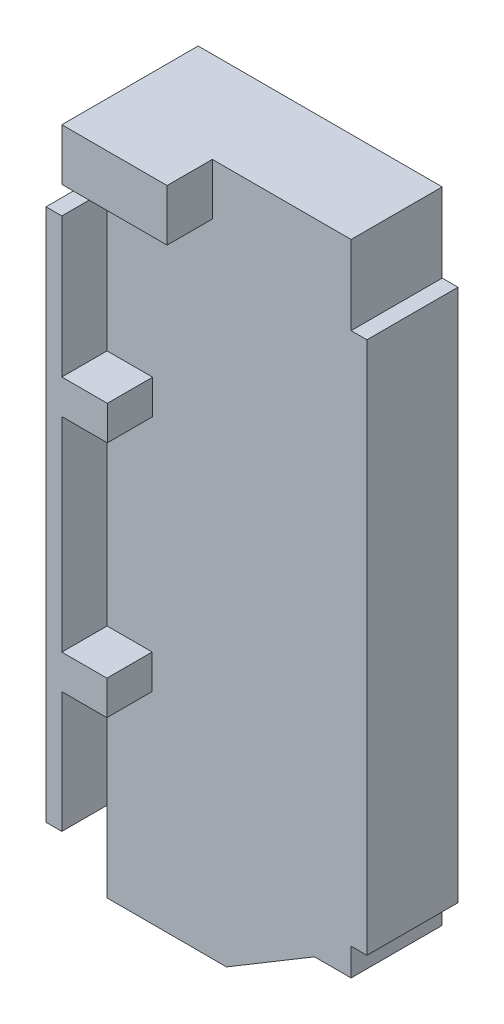
ISO-10303-21;
HEADER;
FILE_DESCRIPTION(('STEP AP214'),'2;1');
FILE_NAME('part.step','',(''),(''),'','','');
FILE_SCHEMA(('AUTOMOTIVE_DESIGN { 1 0 10303 214 1 1 1 1 }'));
ENDSEC;
DATA;
#1=APPLICATION_CONTEXT('core data for automotive mechanical design processes');
#2=APPLICATION_PROTOCOL_DEFINITION('international standard','automotive_design',2000,#1);
#3=PRODUCT_CONTEXT('',#1,'mechanical');
#4=PRODUCT('Part','Part','',(#3));
#5=PRODUCT_RELATED_PRODUCT_CATEGORY('part','',(#4));
#6=PRODUCT_DEFINITION_FORMATION('','',#4);
#7=PRODUCT_DEFINITION_CONTEXT('part definition',#1,'design');
#8=PRODUCT_DEFINITION('design','',#6,#7);
#9=PRODUCT_DEFINITION_SHAPE('','',#8);
#10=(LENGTH_UNIT() NAMED_UNIT(*) SI_UNIT(.MILLI.,.METRE.));
#11=(NAMED_UNIT(*) PLANE_ANGLE_UNIT() SI_UNIT($,.RADIAN.));
#12=(NAMED_UNIT(*) SI_UNIT($,.STERADIAN.) SOLID_ANGLE_UNIT());
#13=UNCERTAINTY_MEASURE_WITH_UNIT(LENGTH_MEASURE(1.E-05),#10,'distance_accuracy_value','');
#14=(GEOMETRIC_REPRESENTATION_CONTEXT(3) GLOBAL_UNCERTAINTY_ASSIGNED_CONTEXT((#13)) GLOBAL_UNIT_ASSIGNED_CONTEXT((#10,
#11,#12)) REPRESENTATION_CONTEXT('',''));
#15=CARTESIAN_POINT('',(0.,0.,0.));
#16=DIRECTION('',(0.,0.,1.));
#17=DIRECTION('',(1.,0.,0.));
#18=AXIS2_PLACEMENT_3D('',#15,#16,#17);
#19=CARTESIAN_POINT('',(0.,0.,0.));
#20=DIRECTION('',(0.,0.,1.));
#21=DIRECTION('',(1.,0.,0.));
#22=AXIS2_PLACEMENT_3D('',#19,#20,#21);
#23=PLANE('',#22);
#24=DIRECTION('',(0.,-1.,0.));
#25=VECTOR('',#24,1.);
#26=CARTESIAN_POINT('',(25.4000000000001,0.,0.));
#27=LINE('',#26,#25);
#28=CARTESIAN_POINT('',(25.4,422.275,0.));
#29=VERTEX_POINT('',#28);
#30=CARTESIAN_POINT('',(25.4,397.3703,0.));
#31=VERTEX_POINT('',#30);
#32=EDGE_CURVE('E53',#29,#31,#27,.T.);
#33=ORIENTED_EDGE('',*,*,#32,.T.);
#34=DIRECTION('',(1.,0.,0.));
#35=VECTOR('',#34,1.);
#36=CARTESIAN_POINT('',(0.,397.3703,0.));
#37=LINE('',#36,#35);
#38=CARTESIAN_POINT('',(-25.4,397.3703,0.));
#39=VERTEX_POINT('',#38);
#40=EDGE_CURVE('E618',#39,#31,#37,.T.);
#41=ORIENTED_EDGE('',*,*,#40,.F.);
#42=DIRECTION('',(0.,1.,0.));
#43=VECTOR('',#42,1.);
#44=CARTESIAN_POINT('',(-25.3999999999999,0.,0.));
#45=LINE('',#44,#43);
#46=CARTESIAN_POINT('',(-25.4,384.175,0.));
#47=VERTEX_POINT('',#46);
#48=EDGE_CURVE('E204',#47,#39,#45,.T.);
#49=ORIENTED_EDGE('',*,*,#48,.F.);
#50=DIRECTION('',(0.,-1.,0.));
#51=VECTOR('',#50,1.);
#52=CARTESIAN_POINT('',(-25.4,0.,0.));
#53=LINE('',#52,#51);
#54=CARTESIAN_POINT('',(-25.4,316.865,0.));
#55=VERTEX_POINT('',#54);
#56=EDGE_CURVE('E248',#47,#55,#53,.T.);
#57=ORIENTED_EDGE('',*,*,#56,.T.);
#58=DIRECTION('',(1.,0.,0.));
#59=VECTOR('',#58,1.);
#60=CARTESIAN_POINT('',(0.,316.865,0.));
#61=LINE('',#60,#59);
#62=CARTESIAN_POINT('',(-3.42900000000004,316.865,0.));
#63=VERTEX_POINT('',#62);
#64=EDGE_CURVE('E257',#55,#63,#61,.T.);
#65=ORIENTED_EDGE('',*,*,#64,.T.);
#66=DIRECTION('',(0.,-1.,0.));
#67=VECTOR('',#66,1.);
#68=CARTESIAN_POINT('',(-3.42899999999998,0.,0.));
#69=LINE('',#68,#67);
#70=CARTESIAN_POINT('',(-3.42900000000004,300.355,0.));
#71=VERTEX_POINT('',#70);
#72=EDGE_CURVE('E266',#63,#71,#69,.T.);
#73=ORIENTED_EDGE('',*,*,#72,.T.);
#74=DIRECTION('',(1.,0.,0.));
#75=VECTOR('',#74,1.);
#76=CARTESIAN_POINT('',(0.,300.355,0.));
#77=LINE('',#76,#75);
#78=CARTESIAN_POINT('',(-25.4,300.355,0.));
#79=VERTEX_POINT('',#78);
#80=EDGE_CURVE('E259',#79,#71,#77,.T.);
#81=ORIENTED_EDGE('',*,*,#80,.F.);
#82=CARTESIAN_POINT('',(-25.4,201.93,0.));
#83=VERTEX_POINT('',#82);
#84=EDGE_CURVE('E249',#79,#83,#53,.T.);
#85=ORIENTED_EDGE('',*,*,#84,.T.);
#86=DIRECTION('',(1.,0.,0.));
#87=VECTOR('',#86,1.);
#88=CARTESIAN_POINT('',(0.,201.93,0.));
#89=LINE('',#88,#87);
#90=CARTESIAN_POINT('',(-3.65760000000002,201.93,0.));
#91=VERTEX_POINT('',#90);
#92=EDGE_CURVE('E260',#83,#91,#89,.T.);
#93=ORIENTED_EDGE('',*,*,#92,.T.);
#94=DIRECTION('',(0.,-1.,0.));
#95=VECTOR('',#94,1.);
#96=CARTESIAN_POINT('',(-3.65760000000002,0.,0.));
#97=LINE('',#96,#95);
#98=CARTESIAN_POINT('',(-3.65760000000002,185.42,0.));
#99=VERTEX_POINT('',#98);
#100=EDGE_CURVE('E250',#91,#99,#97,.T.);
#101=ORIENTED_EDGE('',*,*,#100,.T.);
#102=DIRECTION('',(1.,0.,0.));
#103=VECTOR('',#102,1.);
#104=CARTESIAN_POINT('',(0.,185.42,0.));
#105=LINE('',#104,#103);
#106=CARTESIAN_POINT('',(-25.4,185.42,0.));
#107=VERTEX_POINT('',#106);
#108=EDGE_CURVE('E243',#107,#99,#105,.T.);
#109=ORIENTED_EDGE('',*,*,#108,.F.);
#110=CARTESIAN_POINT('',(-25.4,127.,0.));
#111=VERTEX_POINT('',#110);
#112=EDGE_CURVE('E239',#107,#111,#53,.T.);
#113=ORIENTED_EDGE('',*,*,#112,.T.);
#114=DIRECTION('',(0.,-1.,0.));
#115=VECTOR('',#114,1.);
#116=CARTESIAN_POINT('',(-25.4,0.,0.));
#117=LINE('',#116,#115);
#118=CARTESIAN_POINT('',(-25.4,88.2904,0.));
#119=VERTEX_POINT('',#118);
#120=EDGE_CURVE('E178',#111,#119,#117,.T.);
#121=ORIENTED_EDGE('',*,*,#120,.T.);
#122=DIRECTION('',(1.,0.,0.));
#123=VECTOR('',#122,1.);
#124=CARTESIAN_POINT('',(0.,88.2904,0.));
#125=LINE('',#124,#123);
#126=CARTESIAN_POINT('',(32.2122800000001,88.2904,0.));
#127=VERTEX_POINT('',#126);
#128=EDGE_CURVE('E181',#119,#127,#125,.T.);
#129=ORIENTED_EDGE('',*,*,#128,.T.);
#130=DIRECTION('',(-0.857827979027466,-0.513936920640708,0.));
#131=VECTOR('',#130,1.);
#132=CARTESIAN_POINT('',(-30.4162750213648,50.7687435621342,0.));
#133=LINE('',#132,#131);
#134=CARTESIAN_POINT('',(74.6506,113.7158,0.));
#135=VERTEX_POINT('',#134);
#136=EDGE_CURVE('E185',#135,#127,#133,.T.);
#137=ORIENTED_EDGE('',*,*,#136,.F.);
#138=DIRECTION('',(-1.,0.,0.));
#139=VECTOR('',#138,1.);
#140=CARTESIAN_POINT('',(0.,113.7158,0.));
#141=LINE('',#140,#139);
#142=CARTESIAN_POINT('',(92.329,113.7158,0.));
#143=VERTEX_POINT('',#142);
#144=EDGE_CURVE('E188',#143,#135,#141,.T.);
#145=ORIENTED_EDGE('',*,*,#144,.F.);
#146=DIRECTION('',(0.,-1.,0.));
#147=VECTOR('',#146,1.);
#148=CARTESIAN_POINT('',(92.329,0.,0.));
#149=LINE('',#148,#147);
#150=CARTESIAN_POINT('',(92.329,127.,0.));
#151=VERTEX_POINT('',#150);
#152=EDGE_CURVE('E190',#151,#143,#149,.T.);
#153=ORIENTED_EDGE('',*,*,#152,.F.);
#154=DIRECTION('',(1.,0.,0.));
#155=VECTOR('',#154,1.);
#156=CARTESIAN_POINT('',(0.,127.,0.));
#157=LINE('',#156,#155);
#158=CARTESIAN_POINT('',(99.949,127.,0.));
#159=VERTEX_POINT('',#158);
#160=EDGE_CURVE('E192',#151,#159,#157,.T.);
#161=ORIENTED_EDGE('',*,*,#160,.T.);
#162=DIRECTION('',(0.,-1.,0.));
#163=VECTOR('',#162,1.);
#164=CARTESIAN_POINT('',(99.949,0.,0.));
#165=LINE('',#164,#163);
#166=CARTESIAN_POINT('',(99.9489999999999,384.175,0.));
#167=VERTEX_POINT('',#166);
#168=EDGE_CURVE('E195',#167,#159,#165,.T.);
#169=ORIENTED_EDGE('',*,*,#168,.F.);
#170=DIRECTION('',(1.,0.,0.));
#171=VECTOR('',#170,1.);
#172=CARTESIAN_POINT('',(2.79868720790926E-12,384.175000000001,0.));
#173=LINE('',#172,#171);
#174=CARTESIAN_POINT('',(92.329,384.175,0.));
#175=VERTEX_POINT('',#174);
#176=EDGE_CURVE('E198',#175,#167,#173,.T.);
#177=ORIENTED_EDGE('',*,*,#176,.F.);
#178=DIRECTION('',(0.,1.,0.));
#179=VECTOR('',#178,1.);
#180=CARTESIAN_POINT('',(92.329,0.,0.));
#181=LINE('',#180,#179);
#182=CARTESIAN_POINT('',(92.329,422.275,0.));
#183=VERTEX_POINT('',#182);
#184=EDGE_CURVE('E200',#175,#183,#181,.T.);
#185=ORIENTED_EDGE('',*,*,#184,.T.);
#186=DIRECTION('',(1.,0.,0.));
#187=VECTOR('',#186,1.);
#188=CARTESIAN_POINT('',(0.,422.275,0.));
#189=LINE('',#188,#187);
#190=EDGE_CURVE('E102',#29,#183,#189,.T.);
#191=ORIENTED_EDGE('',*,*,#190,.F.);
#192=EDGE_LOOP('',(#33,#41,#49,#57,#65,#73,#81,#85,#93,#101,#109,#113,#121,#129,#137,#145,#153,
#161,#169,#177,#185,#191));
#193=FACE_BOUND('',#192,.T.);
#194=ADVANCED_FACE('F36',(#193),#23,.T.);
#195=CARTESIAN_POINT('',(0.,127.,-43.942));
#196=DIRECTION('',(0.,1.,0.));
#197=DIRECTION('',(0.,0.,1.));
#198=AXIS2_PLACEMENT_3D('',#195,#196,#197);
#199=PLANE('',#198);
#200=DIRECTION('',(0.,0.,1.));
#201=VECTOR('',#200,1.);
#202=CARTESIAN_POINT('',(-25.4,127.,-43.942));
#203=LINE('',#202,#201);
#204=CARTESIAN_POINT('',(-25.4,127.,-43.942));
#205=VERTEX_POINT('',#204);
#206=EDGE_CURVE('E40',#205,#111,#203,.T.);
#207=ORIENTED_EDGE('',*,*,#206,.T.);
#208=DIRECTION('',(0.,0.,-1.));
#209=VECTOR('',#208,1.);
#210=CARTESIAN_POINT('',(-25.4,127.,21.844));
#211=LINE('',#210,#209);
#212=CARTESIAN_POINT('',(-25.4,127.,21.844));
#213=VERTEX_POINT('',#212);
#214=EDGE_CURVE('E182',#213,#111,#211,.T.);
#215=ORIENTED_EDGE('',*,*,#214,.F.);
#216=DIRECTION('',(-1.,0.,0.));
#217=VECTOR('',#216,1.);
#218=CARTESIAN_POINT('',(0.,127.,21.844));
#219=LINE('',#218,#217);
#220=CARTESIAN_POINT('',(-33.02,127.,21.844));
#221=VERTEX_POINT('',#220);
#222=EDGE_CURVE('E637',#213,#221,#219,.T.);
#223=ORIENTED_EDGE('',*,*,#222,.T.);
#224=DIRECTION('',(0.,0.,1.));
#225=VECTOR('',#224,1.);
#226=CARTESIAN_POINT('',(-33.02,127.,-43.942));
#227=LINE('',#226,#225);
#228=CARTESIAN_POINT('',(-33.02,127.,-43.942));
#229=VERTEX_POINT('',#228);
#230=EDGE_CURVE('E11',#229,#221,#227,.T.);
#231=ORIENTED_EDGE('',*,*,#230,.F.);
#232=DIRECTION('',(-1.,0.,0.));
#233=VECTOR('',#232,1.);
#234=CARTESIAN_POINT('',(0.,127.,-43.942));
#235=LINE('',#234,#233);
#236=EDGE_CURVE('E62',#205,#229,#235,.T.);
#237=ORIENTED_EDGE('',*,*,#236,.F.);
#238=EDGE_LOOP('',(#207,#215,#223,#231,#237));
#239=FACE_BOUND('',#238,.T.);
#240=ADVANCED_FACE('F38',(#239),#199,.F.);
#241=CARTESIAN_POINT('',(-33.02,0.,-43.942));
#242=DIRECTION('',(-1.,0.,0.));
#243=DIRECTION('',(0.,-1.,0.));
#244=AXIS2_PLACEMENT_3D('',#241,#242,#243);
#245=PLANE('',#244);
#246=ORIENTED_EDGE('',*,*,#230,.T.);
#247=DIRECTION('',(0.,-1.,0.));
#248=VECTOR('',#247,1.);
#249=CARTESIAN_POINT('',(-33.02,0.,21.844));
#250=LINE('',#249,#248);
#251=CARTESIAN_POINT('',(-33.02,384.175,21.844));
#252=VERTEX_POINT('',#251);
#253=EDGE_CURVE('E634',#252,#221,#250,.T.);
#254=ORIENTED_EDGE('',*,*,#253,.F.);
#255=DIRECTION('',(0.,0.,1.));
#256=VECTOR('',#255,1.);
#257=CARTESIAN_POINT('',(-33.02,384.175,-43.942));
#258=LINE('',#257,#256);
#259=CARTESIAN_POINT('',(-33.02,384.175,-43.942));
#260=VERTEX_POINT('',#259);
#261=EDGE_CURVE('E45',#260,#252,#258,.T.);
#262=ORIENTED_EDGE('',*,*,#261,.F.);
#263=DIRECTION('',(0.,-1.,0.));
#264=VECTOR('',#263,1.);
#265=CARTESIAN_POINT('',(-33.02,0.,-43.942));
#266=LINE('',#265,#264);
#267=EDGE_CURVE('E173',#260,#229,#266,.T.);
#268=ORIENTED_EDGE('',*,*,#267,.T.);
#269=EDGE_LOOP('',(#246,#254,#262,#268));
#270=FACE_BOUND('',#269,.T.);
#271=ADVANCED_FACE('F373',(#270),#245,.T.);
#272=CARTESIAN_POINT('',(-2.79868720790925E-12,384.175,-43.942));
#273=DIRECTION('',(0.,1.,0.));
#274=DIRECTION('',(-1.,0.,0.));
#275=AXIS2_PLACEMENT_3D('',#272,#273,#274);
#276=PLANE('',#275);
#277=ORIENTED_EDGE('',*,*,#261,.T.);
#278=DIRECTION('',(-1.,0.,0.));
#279=VECTOR('',#278,1.);
#280=CARTESIAN_POINT('',(-2.79868720790925E-12,384.175,21.844));
#281=LINE('',#280,#279);
#282=CARTESIAN_POINT('',(-25.4,384.175,21.844));
#283=VERTEX_POINT('',#282);
#284=EDGE_CURVE('E256',#283,#252,#281,.T.);
#285=ORIENTED_EDGE('',*,*,#284,.F.);
#286=DIRECTION('',(0.,0.,-1.));
#287=VECTOR('',#286,1.);
#288=CARTESIAN_POINT('',(-25.4,384.175,21.844));
#289=LINE('',#288,#287);
#290=EDGE_CURVE('E156',#283,#47,#289,.T.);
#291=ORIENTED_EDGE('',*,*,#290,.T.);
#292=DIRECTION('',(0.,0.,1.));
#293=VECTOR('',#292,1.);
#294=CARTESIAN_POINT('',(-25.4,384.175,-43.942));
#295=LINE('',#294,#293);
#296=CARTESIAN_POINT('',(-25.4,384.175,-43.942));
#297=VERTEX_POINT('',#296);
#298=EDGE_CURVE('E148',#297,#47,#295,.T.);
#299=ORIENTED_EDGE('',*,*,#298,.F.);
#300=DIRECTION('',(-1.,0.,0.));
#301=VECTOR('',#300,1.);
#302=CARTESIAN_POINT('',(-2.79868720790925E-12,384.175,-43.942));
#303=LINE('',#302,#301);
#304=EDGE_CURVE('E153',#297,#260,#303,.T.);
#305=ORIENTED_EDGE('',*,*,#304,.T.);
#306=EDGE_LOOP('',(#277,#285,#291,#299,#305));
#307=FACE_BOUND('',#306,.T.);
#308=ADVANCED_FACE('F151',(#307),#276,.T.);
#309=CARTESIAN_POINT('',(-25.3999999999999,0.,-43.942));
#310=DIRECTION('',(1.,0.,0.));
#311=DIRECTION('',(0.,1.,0.));
#312=AXIS2_PLACEMENT_3D('',#309,#310,#311);
#313=PLANE('',#312);
#314=ORIENTED_EDGE('',*,*,#48,.T.);
#315=DIRECTION('',(0.,0.,-1.));
#316=VECTOR('',#315,1.);
#317=CARTESIAN_POINT('',(-25.4,397.3703,21.844));
#318=LINE('',#317,#316);
#319=CARTESIAN_POINT('',(-25.4,397.3703,21.844));
#320=VERTEX_POINT('',#319);
#321=EDGE_CURVE('E252',#320,#39,#318,.T.);
#322=ORIENTED_EDGE('',*,*,#321,.F.);
#323=DIRECTION('',(0.,1.,0.));
#324=VECTOR('',#323,1.);
#325=CARTESIAN_POINT('',(-25.3999999999999,0.,21.844));
#326=LINE('',#325,#324);
#327=CARTESIAN_POINT('',(-25.4,422.275,21.844));
#328=VERTEX_POINT('',#327);
#329=EDGE_CURVE('E620',#320,#328,#326,.T.);
#330=ORIENTED_EDGE('',*,*,#329,.T.);
#331=DIRECTION('',(0.,0.,1.));
#332=VECTOR('',#331,1.);
#333=CARTESIAN_POINT('',(-25.4,422.275,-43.942));
#334=LINE('',#333,#332);
#335=CARTESIAN_POINT('',(-25.4,422.275,-43.942));
#336=VERTEX_POINT('',#335);
#337=EDGE_CURVE('E161',#336,#328,#334,.T.);
#338=ORIENTED_EDGE('',*,*,#337,.F.);
#339=DIRECTION('',(0.,1.,0.));
#340=VECTOR('',#339,1.);
#341=CARTESIAN_POINT('',(-25.3999999999999,0.,-43.942));
#342=LINE('',#341,#340);
#343=EDGE_CURVE('E164',#297,#336,#342,.T.);
#344=ORIENTED_EDGE('',*,*,#343,.F.);
#345=ORIENTED_EDGE('',*,*,#298,.T.);
#346=EDGE_LOOP('',(#314,#322,#330,#338,#344,#345));
#347=FACE_BOUND('',#346,.T.);
#348=ADVANCED_FACE('F165',(#347),#313,.F.);
#349=CARTESIAN_POINT('',(0.,422.275,-43.942));
#350=DIRECTION('',(0.,-1.,0.));
#351=DIRECTION('',(0.,0.,-1.));
#352=AXIS2_PLACEMENT_3D('',#349,#350,#351);
#353=PLANE('',#352);
#354=ORIENTED_EDGE('',*,*,#337,.T.);
#355=DIRECTION('',(1.,0.,0.));
#356=VECTOR('',#355,1.);
#357=CARTESIAN_POINT('',(0.,422.275,21.844));
#358=LINE('',#357,#356);
#359=CARTESIAN_POINT('',(25.3999999999999,422.275,21.844));
#360=VERTEX_POINT('',#359);
#361=EDGE_CURVE('E611',#328,#360,#358,.T.);
#362=ORIENTED_EDGE('',*,*,#361,.T.);
#363=DIRECTION('',(0.,0.,-1.));
#364=VECTOR('',#363,1.);
#365=CARTESIAN_POINT('',(25.3999999999999,422.275,21.844));
#366=LINE('',#365,#364);
#367=EDGE_CURVE('E246',#360,#29,#366,.T.);
#368=ORIENTED_EDGE('',*,*,#367,.T.);
#369=ORIENTED_EDGE('',*,*,#190,.T.);
#370=DIRECTION('',(0.,0.,1.));
#371=VECTOR('',#370,1.);
#372=CARTESIAN_POINT('',(92.329,422.275,-43.942));
#373=LINE('',#372,#371);
#374=CARTESIAN_POINT('',(92.329,422.275,-43.942));
#375=VERTEX_POINT('',#374);
#376=EDGE_CURVE('E208',#375,#183,#373,.T.);
#377=ORIENTED_EDGE('',*,*,#376,.F.);
#378=DIRECTION('',(1.,0.,0.));
#379=VECTOR('',#378,1.);
#380=CARTESIAN_POINT('',(0.,422.275,-43.942));
#381=LINE('',#380,#379);
#382=EDGE_CURVE('E169',#336,#375,#381,.T.);
#383=ORIENTED_EDGE('',*,*,#382,.F.);
#384=EDGE_LOOP('',(#354,#362,#368,#369,#377,#383));
#385=FACE_BOUND('',#384,.T.);
#386=ADVANCED_FACE('F326',(#385),#353,.F.);
#387=CARTESIAN_POINT('',(92.329,0.,-43.942));
#388=DIRECTION('',(1.,0.,0.));
#389=DIRECTION('',(0.,0.,-1.));
#390=AXIS2_PLACEMENT_3D('',#387,#388,#389);
#391=PLANE('',#390);
#392=ORIENTED_EDGE('',*,*,#184,.F.);
#393=DIRECTION('',(0.,0.,1.));
#394=VECTOR('',#393,1.);
#395=CARTESIAN_POINT('',(92.329,384.175,-43.942));
#396=LINE('',#395,#394);
#397=CARTESIAN_POINT('',(92.329,384.175,-43.942));
#398=VERTEX_POINT('',#397);
#399=EDGE_CURVE('E210',#398,#175,#396,.T.);
#400=ORIENTED_EDGE('',*,*,#399,.F.);
#401=DIRECTION('',(0.,1.,0.));
#402=VECTOR('',#401,1.);
#403=CARTESIAN_POINT('',(92.329,0.,-43.942));
#404=LINE('',#403,#402);
#405=EDGE_CURVE('E323',#398,#375,#404,.T.);
#406=ORIENTED_EDGE('',*,*,#405,.T.);
#407=ORIENTED_EDGE('',*,*,#376,.T.);
#408=EDGE_LOOP('',(#392,#400,#406,#407));
#409=FACE_BOUND('',#408,.T.);
#410=ADVANCED_FACE('F329',(#409),#391,.T.);
#411=CARTESIAN_POINT('',(2.79868720790926E-12,384.175000000001,-43.942));
#412=DIRECTION('',(0.,-1.,0.));
#413=DIRECTION('',(1.,0.,0.));
#414=AXIS2_PLACEMENT_3D('',#411,#412,#413);
#415=PLANE('',#414);
#416=ORIENTED_EDGE('',*,*,#176,.T.);
#417=DIRECTION('',(0.,0.,1.));
#418=VECTOR('',#417,1.);
#419=CARTESIAN_POINT('',(99.9489999999999,384.175,-43.942));
#420=LINE('',#419,#418);
#421=CARTESIAN_POINT('',(99.9489999999999,384.175,-43.942));
#422=VERTEX_POINT('',#421);
#423=EDGE_CURVE('E212',#422,#167,#420,.T.);
#424=ORIENTED_EDGE('',*,*,#423,.F.);
#425=DIRECTION('',(1.,0.,0.));
#426=VECTOR('',#425,1.);
#427=CARTESIAN_POINT('',(2.79868720790926E-12,384.175000000001,-43.942));
#428=LINE('',#427,#426);
#429=EDGE_CURVE('E321',#398,#422,#428,.T.);
#430=ORIENTED_EDGE('',*,*,#429,.F.);
#431=ORIENTED_EDGE('',*,*,#399,.T.);
#432=EDGE_LOOP('',(#416,#424,#430,#431));
#433=FACE_BOUND('',#432,.T.);
#434=ADVANCED_FACE('F334',(#433),#415,.F.);
#435=CARTESIAN_POINT('',(99.949,0.,-43.942));
#436=DIRECTION('',(-1.,0.,0.));
#437=DIRECTION('',(0.,-1.,0.));
#438=AXIS2_PLACEMENT_3D('',#435,#436,#437);
#439=PLANE('',#438);
#440=ORIENTED_EDGE('',*,*,#168,.T.);
#441=DIRECTION('',(0.,0.,1.));
#442=VECTOR('',#441,1.);
#443=CARTESIAN_POINT('',(99.949,127.,-43.942));
#444=LINE('',#443,#442);
#445=CARTESIAN_POINT('',(99.949,127.,-43.942));
#446=VERTEX_POINT('',#445);
#447=EDGE_CURVE('E215',#446,#159,#444,.T.);
#448=ORIENTED_EDGE('',*,*,#447,.F.);
#449=DIRECTION('',(0.,-1.,0.));
#450=VECTOR('',#449,1.);
#451=CARTESIAN_POINT('',(99.949,0.,-43.942));
#452=LINE('',#451,#450);
#453=EDGE_CURVE('E319',#422,#446,#452,.T.);
#454=ORIENTED_EDGE('',*,*,#453,.F.);
#455=ORIENTED_EDGE('',*,*,#423,.T.);
#456=EDGE_LOOP('',(#440,#448,#454,#455));
#457=FACE_BOUND('',#456,.T.);
#458=ADVANCED_FACE('F339',(#457),#439,.F.);
#459=CARTESIAN_POINT('',(0.,127.,-43.942));
#460=DIRECTION('',(0.,-1.,0.));
#461=DIRECTION('',(0.,0.,-1.));
#462=AXIS2_PLACEMENT_3D('',#459,#460,#461);
#463=PLANE('',#462);
#464=ORIENTED_EDGE('',*,*,#160,.F.);
#465=DIRECTION('',(0.,0.,1.));
#466=VECTOR('',#465,1.);
#467=CARTESIAN_POINT('',(92.329,127.,-43.942));
#468=LINE('',#467,#466);
#469=CARTESIAN_POINT('',(92.329,127.,-43.942));
#470=VERTEX_POINT('',#469);
#471=EDGE_CURVE('E217',#470,#151,#468,.T.);
#472=ORIENTED_EDGE('',*,*,#471,.F.);
#473=DIRECTION('',(1.,0.,0.));
#474=VECTOR('',#473,1.);
#475=CARTESIAN_POINT('',(0.,127.,-43.942));
#476=LINE('',#475,#474);
#477=EDGE_CURVE('E316',#470,#446,#476,.T.);
#478=ORIENTED_EDGE('',*,*,#477,.T.);
#479=ORIENTED_EDGE('',*,*,#447,.T.);
#480=EDGE_LOOP('',(#464,#472,#478,#479));
#481=FACE_BOUND('',#480,.T.);
#482=ADVANCED_FACE('F343',(#481),#463,.T.);
#483=CARTESIAN_POINT('',(92.329,0.,-43.942));
#484=DIRECTION('',(-1.,0.,0.));
#485=DIRECTION('',(0.,0.,1.));
#486=AXIS2_PLACEMENT_3D('',#483,#484,#485);
#487=PLANE('',#486);
#488=ORIENTED_EDGE('',*,*,#152,.T.);
#489=DIRECTION('',(0.,0.,1.));
#490=VECTOR('',#489,1.);
#491=CARTESIAN_POINT('',(92.329,113.7158,-43.942));
#492=LINE('',#491,#490);
#493=CARTESIAN_POINT('',(92.329,113.7158,-43.942));
#494=VERTEX_POINT('',#493);
#495=EDGE_CURVE('E219',#494,#143,#492,.T.);
#496=ORIENTED_EDGE('',*,*,#495,.F.);
#497=DIRECTION('',(0.,-1.,0.));
#498=VECTOR('',#497,1.);
#499=CARTESIAN_POINT('',(92.329,0.,-43.942));
#500=LINE('',#499,#498);
#501=EDGE_CURVE('E314',#470,#494,#500,.T.);
#502=ORIENTED_EDGE('',*,*,#501,.F.);
#503=ORIENTED_EDGE('',*,*,#471,.T.);
#504=EDGE_LOOP('',(#488,#496,#502,#503));
#505=FACE_BOUND('',#504,.T.);
#506=ADVANCED_FACE('F348',(#505),#487,.F.);
#507=CARTESIAN_POINT('',(0.,113.7158,-43.942));
#508=DIRECTION('',(0.,1.,0.));
#509=DIRECTION('',(0.,0.,1.));
#510=AXIS2_PLACEMENT_3D('',#507,#508,#509);
#511=PLANE('',#510);
#512=ORIENTED_EDGE('',*,*,#144,.T.);
#513=DIRECTION('',(0.,0.,1.));
#514=VECTOR('',#513,1.);
#515=CARTESIAN_POINT('',(74.6506,113.7158,-43.942));
#516=LINE('',#515,#514);
#517=CARTESIAN_POINT('',(74.6506,113.7158,-43.942));
#518=VERTEX_POINT('',#517);
#519=EDGE_CURVE('E222',#518,#135,#516,.T.);
#520=ORIENTED_EDGE('',*,*,#519,.F.);
#521=DIRECTION('',(-1.,0.,0.));
#522=VECTOR('',#521,1.);
#523=CARTESIAN_POINT('',(0.,113.7158,-43.942));
#524=LINE('',#523,#522);
#525=EDGE_CURVE('E312',#494,#518,#524,.T.);
#526=ORIENTED_EDGE('',*,*,#525,.F.);
#527=ORIENTED_EDGE('',*,*,#495,.T.);
#528=EDGE_LOOP('',(#512,#520,#526,#527));
#529=FACE_BOUND('',#528,.T.);
#530=ADVANCED_FACE('F355',(#529),#511,.F.);
#531=CARTESIAN_POINT('',(-30.4162750213648,50.7687435621342,-43.942));
#532=DIRECTION('',(-0.513936920640708,0.857827979027466,0.));
#533=DIRECTION('',(-0.857827979027466,-0.513936920640708,0.));
#534=AXIS2_PLACEMENT_3D('',#531,#532,#533);
#535=PLANE('',#534);
#536=ORIENTED_EDGE('',*,*,#136,.T.);
#537=DIRECTION('',(0.,0.,1.));
#538=VECTOR('',#537,1.);
#539=CARTESIAN_POINT('',(32.2122800000001,88.2904,-43.942));
#540=LINE('',#539,#538);
#541=CARTESIAN_POINT('',(32.2122800000001,88.2904,-43.942));
#542=VERTEX_POINT('',#541);
#543=EDGE_CURVE('E225',#542,#127,#540,.T.);
#544=ORIENTED_EDGE('',*,*,#543,.F.);
#545=DIRECTION('',(-0.857827979027466,-0.513936920640708,0.));
#546=VECTOR('',#545,1.);
#547=CARTESIAN_POINT('',(-30.4162750213648,50.7687435621342,-43.942));
#548=LINE('',#547,#546);
#549=EDGE_CURVE('E310',#518,#542,#548,.T.);
#550=ORIENTED_EDGE('',*,*,#549,.F.);
#551=ORIENTED_EDGE('',*,*,#519,.T.);
#552=EDGE_LOOP('',(#536,#544,#550,#551));
#553=FACE_BOUND('',#552,.T.);
#554=ADVANCED_FACE('F358',(#553),#535,.F.);
#555=CARTESIAN_POINT('',(0.,88.2904,-43.942));
#556=DIRECTION('',(0.,-1.,0.));
#557=DIRECTION('',(0.,0.,-1.));
#558=AXIS2_PLACEMENT_3D('',#555,#556,#557);
#559=PLANE('',#558);
#560=ORIENTED_EDGE('',*,*,#128,.F.);
#561=DIRECTION('',(0.,0.,1.));
#562=VECTOR('',#561,1.);
#563=CARTESIAN_POINT('',(-25.4,88.2904,-43.942));
#564=LINE('',#563,#562);
#565=CARTESIAN_POINT('',(-25.4,88.2904,-43.942));
#566=VERTEX_POINT('',#565);
#567=EDGE_CURVE('E226',#566,#119,#564,.T.);
#568=ORIENTED_EDGE('',*,*,#567,.F.);
#569=DIRECTION('',(1.,0.,0.));
#570=VECTOR('',#569,1.);
#571=CARTESIAN_POINT('',(0.,88.2904,-43.942));
#572=LINE('',#571,#570);
#573=EDGE_CURVE('E307',#566,#542,#572,.T.);
#574=ORIENTED_EDGE('',*,*,#573,.T.);
#575=ORIENTED_EDGE('',*,*,#543,.T.);
#576=EDGE_LOOP('',(#560,#568,#574,#575));
#577=FACE_BOUND('',#576,.T.);
#578=ADVANCED_FACE('F360',(#577),#559,.T.);
#579=CARTESIAN_POINT('',(-25.4,0.,-43.942));
#580=DIRECTION('',(-1.,0.,0.));
#581=DIRECTION('',(0.,-1.,0.));
#582=AXIS2_PLACEMENT_3D('',#579,#580,#581);
#583=PLANE('',#582);
#584=ORIENTED_EDGE('',*,*,#120,.F.);
#585=ORIENTED_EDGE('',*,*,#206,.F.);
#586=DIRECTION('',(0.,-1.,0.));
#587=VECTOR('',#586,1.);
#588=CARTESIAN_POINT('',(-25.4,0.,-43.942));
#589=LINE('',#588,#587);
#590=EDGE_CURVE('E305',#205,#566,#589,.T.);
#591=ORIENTED_EDGE('',*,*,#590,.T.);
#592=ORIENTED_EDGE('',*,*,#567,.T.);
#593=EDGE_LOOP('',(#584,#585,#591,#592));
#594=FACE_BOUND('',#593,.T.);
#595=ADVANCED_FACE('F233',(#594),#583,.T.);
#596=CARTESIAN_POINT('',(0.,0.,-43.942));
#597=DIRECTION('',(0.,0.,1.));
#598=DIRECTION('',(1.,0.,0.));
#599=AXIS2_PLACEMENT_3D('',#596,#597,#598);
#600=PLANE('',#599);
#601=ORIENTED_EDGE('',*,*,#236,.T.);
#602=ORIENTED_EDGE('',*,*,#267,.F.);
#603=ORIENTED_EDGE('',*,*,#304,.F.);
#604=ORIENTED_EDGE('',*,*,#343,.T.);
#605=ORIENTED_EDGE('',*,*,#382,.T.);
#606=ORIENTED_EDGE('',*,*,#405,.F.);
#607=ORIENTED_EDGE('',*,*,#429,.T.);
#608=ORIENTED_EDGE('',*,*,#453,.T.);
#609=ORIENTED_EDGE('',*,*,#477,.F.);
#610=ORIENTED_EDGE('',*,*,#501,.T.);
#611=ORIENTED_EDGE('',*,*,#525,.T.);
#612=ORIENTED_EDGE('',*,*,#549,.T.);
#613=ORIENTED_EDGE('',*,*,#573,.F.);
#614=ORIENTED_EDGE('',*,*,#590,.F.);
#615=EDGE_LOOP('',(#601,#602,#603,#604,#605,#606,#607,#608,#609,#610,#611,#612,#613,#614));
#616=FACE_BOUND('',#615,.T.);
#617=ADVANCED_FACE('F171',(#616),#600,.F.);
#618=CARTESIAN_POINT('',(-25.4,0.,21.844));
#619=DIRECTION('',(1.,0.,0.));
#620=DIRECTION('',(0.,1.,0.));
#621=AXIS2_PLACEMENT_3D('',#618,#619,#620);
#622=PLANE('',#621);
#623=ORIENTED_EDGE('',*,*,#112,.F.);
#624=DIRECTION('',(0.,0.,-1.));
#625=VECTOR('',#624,1.);
#626=CARTESIAN_POINT('',(-25.4,185.42,21.844));
#627=LINE('',#626,#625);
#628=CARTESIAN_POINT('',(-25.4,185.42,21.844));
#629=VERTEX_POINT('',#628);
#630=EDGE_CURVE('E300',#629,#107,#627,.T.);
#631=ORIENTED_EDGE('',*,*,#630,.F.);
#632=DIRECTION('',(0.,-1.,0.));
#633=VECTOR('',#632,1.);
#634=CARTESIAN_POINT('',(-25.4,0.,21.844));
#635=LINE('',#634,#633);
#636=EDGE_CURVE('E639',#629,#213,#635,.T.);
#637=ORIENTED_EDGE('',*,*,#636,.T.);
#638=ORIENTED_EDGE('',*,*,#214,.T.);
#639=EDGE_LOOP('',(#623,#631,#637,#638));
#640=FACE_BOUND('',#639,.T.);
#641=ADVANCED_FACE('F418',(#640),#622,.T.);
#642=CARTESIAN_POINT('',(0.,185.42,21.844));
#643=DIRECTION('',(0.,1.,0.));
#644=DIRECTION('',(0.,0.,1.));
#645=AXIS2_PLACEMENT_3D('',#642,#643,#644);
#646=PLANE('',#645);
#647=ORIENTED_EDGE('',*,*,#108,.T.);
#648=DIRECTION('',(0.,0.,-1.));
#649=VECTOR('',#648,1.);
#650=CARTESIAN_POINT('',(-3.65760000000002,185.42,21.844));
#651=LINE('',#650,#649);
#652=CARTESIAN_POINT('',(-3.65760000000002,185.42,21.844));
#653=VERTEX_POINT('',#652);
#654=EDGE_CURVE('E297',#653,#99,#651,.T.);
#655=ORIENTED_EDGE('',*,*,#654,.F.);
#656=DIRECTION('',(1.,0.,0.));
#657=VECTOR('',#656,1.);
#658=CARTESIAN_POINT('',(0.,185.42,21.844));
#659=LINE('',#658,#657);
#660=EDGE_CURVE('E642',#629,#653,#659,.T.);
#661=ORIENTED_EDGE('',*,*,#660,.F.);
#662=ORIENTED_EDGE('',*,*,#630,.T.);
#663=EDGE_LOOP('',(#647,#655,#661,#662));
#664=FACE_BOUND('',#663,.T.);
#665=ADVANCED_FACE('F476',(#664),#646,.F.);
#666=CARTESIAN_POINT('',(-3.65760000000002,0.,21.844));
#667=DIRECTION('',(1.,0.,0.));
#668=DIRECTION('',(0.,1.,0.));
#669=AXIS2_PLACEMENT_3D('',#666,#667,#668);
#670=PLANE('',#669);
#671=ORIENTED_EDGE('',*,*,#100,.F.);
#672=DIRECTION('',(0.,0.,-1.));
#673=VECTOR('',#672,1.);
#674=CARTESIAN_POINT('',(-3.65760000000002,201.93,21.844));
#675=LINE('',#674,#673);
#676=CARTESIAN_POINT('',(-3.65760000000002,201.93,21.844));
#677=VERTEX_POINT('',#676);
#678=EDGE_CURVE('E294',#677,#91,#675,.T.);
#679=ORIENTED_EDGE('',*,*,#678,.F.);
#680=DIRECTION('',(0.,-1.,0.));
#681=VECTOR('',#680,1.);
#682=CARTESIAN_POINT('',(-3.65760000000002,0.,21.844));
#683=LINE('',#682,#681);
#684=EDGE_CURVE('E646',#677,#653,#683,.T.);
#685=ORIENTED_EDGE('',*,*,#684,.T.);
#686=ORIENTED_EDGE('',*,*,#654,.T.);
#687=EDGE_LOOP('',(#671,#679,#685,#686));
#688=FACE_BOUND('',#687,.T.);
#689=ADVANCED_FACE('F488',(#688),#670,.T.);
#690=CARTESIAN_POINT('',(0.,201.93,21.844));
#691=DIRECTION('',(0.,1.,0.));
#692=DIRECTION('',(0.,0.,1.));
#693=AXIS2_PLACEMENT_3D('',#690,#691,#692);
#694=PLANE('',#693);
#695=ORIENTED_EDGE('',*,*,#92,.F.);
#696=DIRECTION('',(0.,0.,-1.));
#697=VECTOR('',#696,1.);
#698=CARTESIAN_POINT('',(-25.4,201.93,21.844));
#699=LINE('',#698,#697);
#700=CARTESIAN_POINT('',(-25.4,201.93,21.844));
#701=VERTEX_POINT('',#700);
#702=EDGE_CURVE('E291',#701,#83,#699,.T.);
#703=ORIENTED_EDGE('',*,*,#702,.F.);
#704=DIRECTION('',(1.,0.,0.));
#705=VECTOR('',#704,1.);
#706=CARTESIAN_POINT('',(0.,201.93,21.844));
#707=LINE('',#706,#705);
#708=EDGE_CURVE('E649',#701,#677,#707,.T.);
#709=ORIENTED_EDGE('',*,*,#708,.T.);
#710=ORIENTED_EDGE('',*,*,#678,.T.);
#711=EDGE_LOOP('',(#695,#703,#709,#710));
#712=FACE_BOUND('',#711,.T.);
#713=ADVANCED_FACE('F497',(#712),#694,.T.);
#714=ORIENTED_EDGE('',*,*,#84,.F.);
#715=DIRECTION('',(0.,0.,-1.));
#716=VECTOR('',#715,1.);
#717=CARTESIAN_POINT('',(-25.4,300.355,21.844));
#718=LINE('',#717,#716);
#719=CARTESIAN_POINT('',(-25.4,300.355,21.844));
#720=VERTEX_POINT('',#719);
#721=EDGE_CURVE('E288',#720,#79,#718,.T.);
#722=ORIENTED_EDGE('',*,*,#721,.F.);
#723=EDGE_CURVE('E643',#720,#701,#635,.T.);
#724=ORIENTED_EDGE('',*,*,#723,.T.);
#725=ORIENTED_EDGE('',*,*,#702,.T.);
#726=EDGE_LOOP('',(#714,#722,#724,#725));
#727=FACE_BOUND('',#726,.T.);
#728=ADVANCED_FACE('F478',(#727),#622,.T.);
#729=CARTESIAN_POINT('',(0.,300.355,21.844));
#730=DIRECTION('',(0.,1.,0.));
#731=DIRECTION('',(0.,0.,1.));
#732=AXIS2_PLACEMENT_3D('',#729,#730,#731);
#733=PLANE('',#732);
#734=ORIENTED_EDGE('',*,*,#80,.T.);
#735=DIRECTION('',(0.,0.,-1.));
#736=VECTOR('',#735,1.);
#737=CARTESIAN_POINT('',(-3.42900000000004,300.355,21.844));
#738=LINE('',#737,#736);
#739=CARTESIAN_POINT('',(-3.42900000000004,300.355,21.844));
#740=VERTEX_POINT('',#739);
#741=EDGE_CURVE('E285',#740,#71,#738,.T.);
#742=ORIENTED_EDGE('',*,*,#741,.F.);
#743=DIRECTION('',(1.,0.,0.));
#744=VECTOR('',#743,1.);
#745=CARTESIAN_POINT('',(0.,300.355,21.844));
#746=LINE('',#745,#744);
#747=EDGE_CURVE('E652',#720,#740,#746,.T.);
#748=ORIENTED_EDGE('',*,*,#747,.F.);
#749=ORIENTED_EDGE('',*,*,#721,.T.);
#750=EDGE_LOOP('',(#734,#742,#748,#749));
#751=FACE_BOUND('',#750,.T.);
#752=ADVANCED_FACE('F517',(#751),#733,.F.);
#753=CARTESIAN_POINT('',(-3.42899999999998,0.,21.844));
#754=DIRECTION('',(1.,0.,0.));
#755=DIRECTION('',(0.,1.,0.));
#756=AXIS2_PLACEMENT_3D('',#753,#754,#755);
#757=PLANE('',#756);
#758=ORIENTED_EDGE('',*,*,#72,.F.);
#759=DIRECTION('',(0.,0.,-1.));
#760=VECTOR('',#759,1.);
#761=CARTESIAN_POINT('',(-3.42900000000004,316.865,21.844));
#762=LINE('',#761,#760);
#763=CARTESIAN_POINT('',(-3.42900000000004,316.865,21.844));
#764=VERTEX_POINT('',#763);
#765=EDGE_CURVE('E282',#764,#63,#762,.T.);
#766=ORIENTED_EDGE('',*,*,#765,.F.);
#767=DIRECTION('',(0.,-1.,0.));
#768=VECTOR('',#767,1.);
#769=CARTESIAN_POINT('',(-3.42899999999998,0.,21.844));
#770=LINE('',#769,#768);
#771=EDGE_CURVE('E655',#764,#740,#770,.T.);
#772=ORIENTED_EDGE('',*,*,#771,.T.);
#773=ORIENTED_EDGE('',*,*,#741,.T.);
#774=EDGE_LOOP('',(#758,#766,#772,#773));
#775=FACE_BOUND('',#774,.T.);
#776=ADVANCED_FACE('F527',(#775),#757,.T.);
#777=CARTESIAN_POINT('',(0.,316.865,21.844));
#778=DIRECTION('',(0.,1.,0.));
#779=DIRECTION('',(0.,0.,1.));
#780=AXIS2_PLACEMENT_3D('',#777,#778,#779);
#781=PLANE('',#780);
#782=ORIENTED_EDGE('',*,*,#64,.F.);
#783=DIRECTION('',(0.,0.,-1.));
#784=VECTOR('',#783,1.);
#785=CARTESIAN_POINT('',(-25.4,316.865,21.844));
#786=LINE('',#785,#784);
#787=CARTESIAN_POINT('',(-25.4,316.865,21.844));
#788=VERTEX_POINT('',#787);
#789=EDGE_CURVE('E278',#788,#55,#786,.T.);
#790=ORIENTED_EDGE('',*,*,#789,.F.);
#791=DIRECTION('',(1.,0.,0.));
#792=VECTOR('',#791,1.);
#793=CARTESIAN_POINT('',(0.,316.865,21.844));
#794=LINE('',#793,#792);
#795=EDGE_CURVE('E657',#788,#764,#794,.T.);
#796=ORIENTED_EDGE('',*,*,#795,.T.);
#797=ORIENTED_EDGE('',*,*,#765,.T.);
#798=EDGE_LOOP('',(#782,#790,#796,#797));
#799=FACE_BOUND('',#798,.T.);
#800=ADVANCED_FACE('F537',(#799),#781,.T.);
#801=ORIENTED_EDGE('',*,*,#56,.F.);
#802=ORIENTED_EDGE('',*,*,#290,.F.);
#803=EDGE_CURVE('E279',#283,#788,#635,.T.);
#804=ORIENTED_EDGE('',*,*,#803,.T.);
#805=ORIENTED_EDGE('',*,*,#789,.T.);
#806=EDGE_LOOP('',(#801,#802,#804,#805));
#807=FACE_BOUND('',#806,.T.);
#808=ADVANCED_FACE('F479',(#807),#622,.T.);
#809=CARTESIAN_POINT('',(0.,0.,21.844));
#810=DIRECTION('',(0.,0.,1.));
#811=DIRECTION('',(1.,0.,0.));
#812=AXIS2_PLACEMENT_3D('',#809,#810,#811);
#813=PLANE('',#812);
#814=ORIENTED_EDGE('',*,*,#284,.T.);
#815=ORIENTED_EDGE('',*,*,#253,.T.);
#816=ORIENTED_EDGE('',*,*,#222,.F.);
#817=ORIENTED_EDGE('',*,*,#636,.F.);
#818=ORIENTED_EDGE('',*,*,#660,.T.);
#819=ORIENTED_EDGE('',*,*,#684,.F.);
#820=ORIENTED_EDGE('',*,*,#708,.F.);
#821=ORIENTED_EDGE('',*,*,#723,.F.);
#822=ORIENTED_EDGE('',*,*,#747,.T.);
#823=ORIENTED_EDGE('',*,*,#771,.F.);
#824=ORIENTED_EDGE('',*,*,#795,.F.);
#825=ORIENTED_EDGE('',*,*,#803,.F.);
#826=EDGE_LOOP('',(#814,#815,#816,#817,#818,#819,#820,#821,#822,#823,#824,#825));
#827=FACE_BOUND('',#826,.T.);
#828=ADVANCED_FACE('F557',(#827),#813,.T.);
#829=CARTESIAN_POINT('',(25.4000000000001,0.,21.844));
#830=DIRECTION('',(1.,0.,0.));
#831=DIRECTION('',(0.,1.,0.));
#832=AXIS2_PLACEMENT_3D('',#829,#830,#831);
#833=PLANE('',#832);
#834=ORIENTED_EDGE('',*,*,#32,.F.);
#835=ORIENTED_EDGE('',*,*,#367,.F.);
#836=DIRECTION('',(0.,-1.,0.));
#837=VECTOR('',#836,1.);
#838=CARTESIAN_POINT('',(25.4000000000001,0.,21.844));
#839=LINE('',#838,#837);
#840=CARTESIAN_POINT('',(25.4,397.3703,21.844));
#841=VERTEX_POINT('',#840);
#842=EDGE_CURVE('E607',#360,#841,#839,.T.);
#843=ORIENTED_EDGE('',*,*,#842,.T.);
#844=DIRECTION('',(0.,0.,-1.));
#845=VECTOR('',#844,1.);
#846=CARTESIAN_POINT('',(25.4,397.3703,21.844));
#847=LINE('',#846,#845);
#848=EDGE_CURVE('E625',#841,#31,#847,.T.);
#849=ORIENTED_EDGE('',*,*,#848,.T.);
#850=EDGE_LOOP('',(#834,#835,#843,#849));
#851=FACE_BOUND('',#850,.T.);
#852=ADVANCED_FACE('F568',(#851),#833,.T.);
#853=CARTESIAN_POINT('',(0.,397.3703,21.844));
#854=DIRECTION('',(0.,1.,0.));
#855=DIRECTION('',(0.,0.,1.));
#856=AXIS2_PLACEMENT_3D('',#853,#854,#855);
#857=PLANE('',#856);
#858=ORIENTED_EDGE('',*,*,#40,.T.);
#859=ORIENTED_EDGE('',*,*,#848,.F.);
#860=DIRECTION('',(1.,0.,0.));
#861=VECTOR('',#860,1.);
#862=CARTESIAN_POINT('',(0.,397.3703,21.844));
#863=LINE('',#862,#861);
#864=EDGE_CURVE('E614',#320,#841,#863,.T.);
#865=ORIENTED_EDGE('',*,*,#864,.F.);
#866=ORIENTED_EDGE('',*,*,#321,.T.);
#867=EDGE_LOOP('',(#858,#859,#865,#866));
#868=FACE_BOUND('',#867,.T.);
#869=ADVANCED_FACE('F579',(#868),#857,.F.);
#870=CARTESIAN_POINT('',(0.,0.,21.844));
#871=DIRECTION('',(0.,0.,1.));
#872=DIRECTION('',(1.,0.,0.));
#873=AXIS2_PLACEMENT_3D('',#870,#871,#872);
#874=PLANE('',#873);
#875=ORIENTED_EDGE('',*,*,#842,.F.);
#876=ORIENTED_EDGE('',*,*,#361,.F.);
#877=ORIENTED_EDGE('',*,*,#329,.F.);
#878=ORIENTED_EDGE('',*,*,#864,.T.);
#879=EDGE_LOOP('',(#875,#876,#877,#878));
#880=FACE_BOUND('',#879,.T.);
#881=ADVANCED_FACE('F588',(#880),#874,.T.);
#882=CLOSED_SHELL('',(#194,#240,#271,#308,#348,#386,#410,#434,#458,#482,#506,#530,#554,#578,
#595,#617,#641,#665,#689,#713,#728,#752,#776,#800,#808,#828,#852,#869,#881));
#883=MANIFOLD_SOLID_BREP('B2',#882);
#884=ADVANCED_BREP_SHAPE_REPRESENTATION('',(#18,#883),#14);
#885=SHAPE_DEFINITION_REPRESENTATION(#9,#884);
ENDSEC;
END-ISO-10303-21;
